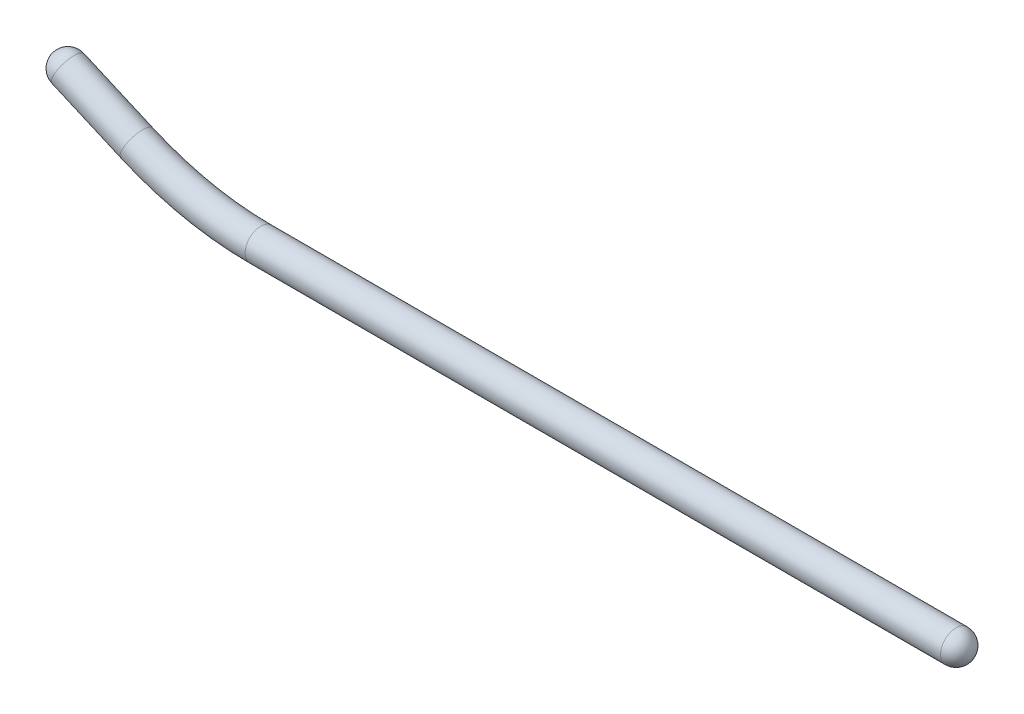
ISO-10303-21;
HEADER;
FILE_DESCRIPTION(('STEP AP214'),'2;1');
FILE_NAME('part.step','',(''),(''),'','','');
FILE_SCHEMA(('AUTOMOTIVE_DESIGN { 1 0 10303 214 1 1 1 1 }'));
ENDSEC;
DATA;
#1=APPLICATION_CONTEXT('core data for automotive mechanical design processes');
#2=APPLICATION_PROTOCOL_DEFINITION('international standard','automotive_design',2000,#1);
#3=PRODUCT_CONTEXT('',#1,'mechanical');
#4=PRODUCT('Part','Part','',(#3));
#5=PRODUCT_RELATED_PRODUCT_CATEGORY('part','',(#4));
#6=PRODUCT_DEFINITION_FORMATION('','',#4);
#7=PRODUCT_DEFINITION_CONTEXT('part definition',#1,'design');
#8=PRODUCT_DEFINITION('design','',#6,#7);
#9=PRODUCT_DEFINITION_SHAPE('','',#8);
#10=(LENGTH_UNIT() NAMED_UNIT(*) SI_UNIT(.MILLI.,.METRE.));
#11=(NAMED_UNIT(*) PLANE_ANGLE_UNIT() SI_UNIT($,.RADIAN.));
#12=(NAMED_UNIT(*) SI_UNIT($,.STERADIAN.) SOLID_ANGLE_UNIT());
#13=UNCERTAINTY_MEASURE_WITH_UNIT(LENGTH_MEASURE(1.E-05),#10,'distance_accuracy_value','');
#14=(GEOMETRIC_REPRESENTATION_CONTEXT(3) GLOBAL_UNCERTAINTY_ASSIGNED_CONTEXT((#13)) GLOBAL_UNIT_ASSIGNED_CONTEXT((#10,
#11,#12)) REPRESENTATION_CONTEXT('',''));
#15=CARTESIAN_POINT('',(0.,0.,0.));
#16=DIRECTION('',(0.,0.,1.));
#17=DIRECTION('',(1.,0.,0.));
#18=AXIS2_PLACEMENT_3D('',#15,#16,#17);
#19=CARTESIAN_POINT('',(0.,0.,0.));
#20=DIRECTION('',(-1.,0.,0.));
#21=DIRECTION('',(0.,0.,1.));
#22=AXIS2_PLACEMENT_3D('',#19,#20,#21);
#23=CYLINDRICAL_SURFACE('',#22,1.);
#24=CARTESIAN_POINT('',(-1.,0.,0.));
#25=DIRECTION('',(-1.,0.,0.));
#26=DIRECTION('',(0.,0.,1.));
#27=AXIS2_PLACEMENT_3D('',#24,#25,#26);
#28=CIRCLE('',#27,1.);
#29=CARTESIAN_POINT('',(-1.,0.,1.));
#30=VERTEX_POINT('',#29);
#31=EDGE_CURVE('E10',#30,#30,#28,.T.);
#32=ORIENTED_EDGE('',*,*,#31,.T.);
#33=EDGE_LOOP('',(#32));
#34=FACE_BOUND('',#33,.T.);
#35=CARTESIAN_POINT('',(-45.8257569495583,0.,0.));
#36=DIRECTION('',(1.,0.,0.));
#37=DIRECTION('',(0.,0.,-1.));
#38=AXIS2_PLACEMENT_3D('',#35,#36,#37);
#39=CIRCLE('',#38,1.);
#40=CARTESIAN_POINT('',(-45.8257569495583,-0.999999999999997,0.));
#41=VERTEX_POINT('',#40);
#42=EDGE_CURVE('E61',#41,#41,#39,.T.);
#43=ORIENTED_EDGE('',*,*,#42,.T.);
#44=EDGE_LOOP('',(#43));
#45=FACE_BOUND('',#44,.T.);
#46=ADVANCED_FACE('F43',(#34,#45),#23,.T.);
#47=CARTESIAN_POINT('',(-45.8257569495584,20.,0.));
#48=DIRECTION('',(0.,0.,-1.));
#49=DIRECTION('',(-1.,0.,0.));
#50=AXIS2_PLACEMENT_3D('',#47,#48,#49);
#51=TOROIDAL_SURFACE('',#50,20.,1.);
#52=CARTESIAN_POINT('',(-53.8257569495585,1.66969722017666,0.));
#53=DIRECTION('',(0.916515138991167,-0.400000000000002,0.));
#54=DIRECTION('',(0.,0.,-1.));
#55=AXIS2_PLACEMENT_3D('',#52,#53,#54);
#56=CIRCLE('',#55,1.);
#57=CARTESIAN_POINT('',(-54.2257569495585,0.753182081185494,0.));
#58=VERTEX_POINT('',#57);
#59=EDGE_CURVE('E56',#58,#58,#56,.T.);
#60=CARTESIAN_POINT('',(-45.8257569495584,20.,0.));
#61=DIRECTION('',(0.,0.,-1.));
#62=DIRECTION('',(-1.,0.,0.));
#63=AXIS2_PLACEMENT_3D('',#60,#61,#62);
#64=CIRCLE('',#63,21.);
#65=EDGE_CURVE('',#41,#58,#64,.T.);
#66=ORIENTED_EDGE('',*,*,#42,.F.);
#67=ORIENTED_EDGE('',*,*,#59,.T.);
#68=ORIENTED_EDGE('',*,*,#65,.T.);
#69=ORIENTED_EDGE('',*,*,#65,.F.);
#70=EDGE_LOOP('',(#66,#68,#67,#69));
#71=FACE_BOUND('',#70,.T.);
#72=ADVANCED_FACE('F69',(#71),#51,.T.);
#73=CARTESIAN_POINT('',(-53.8257569495585,1.66969722017666,0.));
#74=DIRECTION('',(-0.916515138991168,0.4,0.));
#75=DIRECTION('',(-0.4,-0.916515138991168,0.));
#76=AXIS2_PLACEMENT_3D('',#73,#74,#75);
#77=CYLINDRICAL_SURFACE('',#76,1.);
#78=CARTESIAN_POINT('',(-58.2486362509205,3.59999999999999,0.));
#79=DIRECTION('',(-0.916515138991168,0.4,0.));
#80=DIRECTION('',(-0.4,-0.916515138991168,0.));
#81=AXIS2_PLACEMENT_3D('',#78,#79,#80);
#82=CIRCLE('',#81,1.);
#83=CARTESIAN_POINT('',(-58.6486362509205,2.68348486100883,0.));
#84=VERTEX_POINT('',#83);
#85=EDGE_CURVE('E51',#84,#84,#82,.F.);
#86=ORIENTED_EDGE('',*,*,#85,.T.);
#87=EDGE_LOOP('',(#86));
#88=FACE_BOUND('',#87,.T.);
#89=ORIENTED_EDGE('',*,*,#59,.F.);
#90=EDGE_LOOP('',(#89));
#91=FACE_BOUND('',#90,.T.);
#92=ADVANCED_FACE('F71',(#88,#91),#77,.T.);
#93=CARTESIAN_POINT('',(-58.2486362509205,3.59999999999999,0.));
#94=DIRECTION('',(0.916515138991168,-0.4,0.));
#95=DIRECTION('',(0.4,0.916515138991168,0.));
#96=AXIS2_PLACEMENT_3D('',#93,#94,#95);
#97=SPHERICAL_SURFACE('',#96,1.);
#98=ORIENTED_EDGE('',*,*,#85,.F.);
#99=EDGE_LOOP('',(#98));
#100=FACE_BOUND('',#99,.T.);
#101=ADVANCED_FACE('F78',(#100),#97,.T.);
#102=CARTESIAN_POINT('',(-1.,0.,0.));
#103=DIRECTION('',(1.,0.,0.));
#104=DIRECTION('',(0.,0.,-1.));
#105=AXIS2_PLACEMENT_3D('',#102,#103,#104);
#106=SPHERICAL_SURFACE('',#105,1.);
#107=ORIENTED_EDGE('',*,*,#31,.F.);
#108=EDGE_LOOP('',(#107));
#109=FACE_BOUND('',#108,.T.);
#110=ADVANCED_FACE('F45',(#109),#106,.T.);
#111=CLOSED_SHELL('',(#46,#72,#92,#101,#110));
#112=MANIFOLD_SOLID_BREP('B2',#111);
#113=ADVANCED_BREP_SHAPE_REPRESENTATION('',(#18,#112),#14);
#114=SHAPE_DEFINITION_REPRESENTATION(#9,#113);
ENDSEC;
END-ISO-10303-21;
